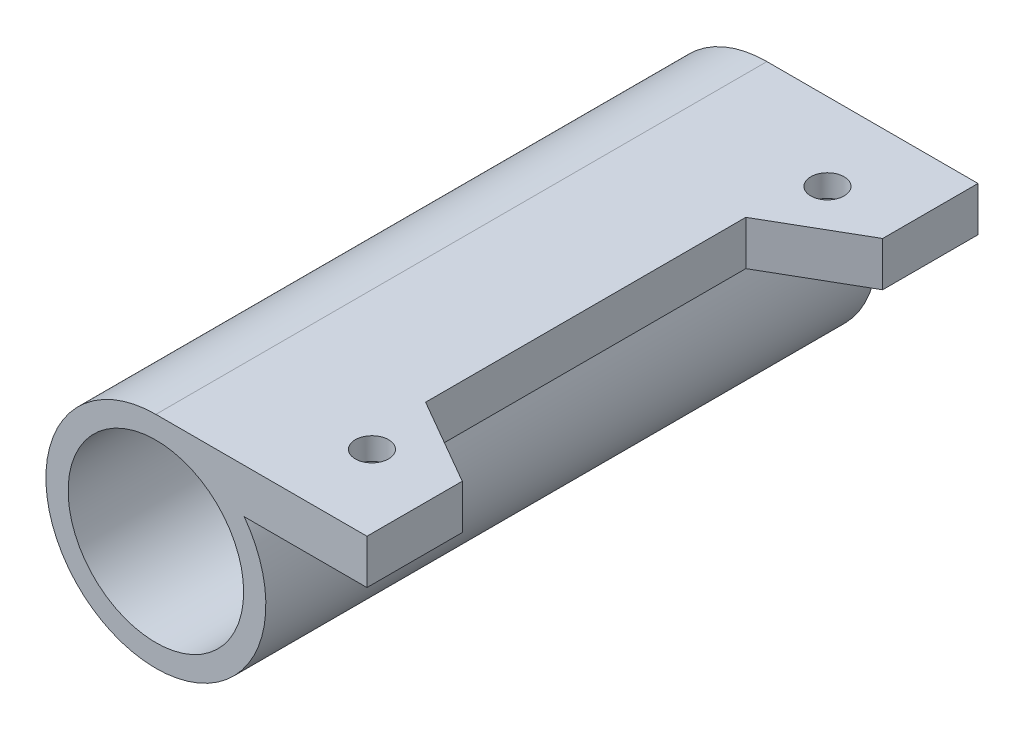
ISO-10303-21;
HEADER;
FILE_DESCRIPTION(('STEP AP214'),'2;1');
FILE_NAME('part.step','',(''),(''),'','','');
FILE_SCHEMA(('AUTOMOTIVE_DESIGN { 1 0 10303 214 1 1 1 1 }'));
ENDSEC;
DATA;
#1=APPLICATION_CONTEXT('core data for automotive mechanical design processes');
#2=APPLICATION_PROTOCOL_DEFINITION('international standard','automotive_design',2000,#1);
#3=PRODUCT_CONTEXT('',#1,'mechanical');
#4=PRODUCT('Part','Part','',(#3));
#5=PRODUCT_RELATED_PRODUCT_CATEGORY('part','',(#4));
#6=PRODUCT_DEFINITION_FORMATION('','',#4);
#7=PRODUCT_DEFINITION_CONTEXT('part definition',#1,'design');
#8=PRODUCT_DEFINITION('design','',#6,#7);
#9=PRODUCT_DEFINITION_SHAPE('','',#8);
#10=(LENGTH_UNIT() NAMED_UNIT(*) SI_UNIT(.MILLI.,.METRE.));
#11=(NAMED_UNIT(*) PLANE_ANGLE_UNIT() SI_UNIT($,.RADIAN.));
#12=(NAMED_UNIT(*) SI_UNIT($,.STERADIAN.) SOLID_ANGLE_UNIT());
#13=UNCERTAINTY_MEASURE_WITH_UNIT(LENGTH_MEASURE(1.E-05),#10,'distance_accuracy_value','');
#14=(GEOMETRIC_REPRESENTATION_CONTEXT(3) GLOBAL_UNCERTAINTY_ASSIGNED_CONTEXT((#13)) GLOBAL_UNIT_ASSIGNED_CONTEXT((#10,
#11,#12)) REPRESENTATION_CONTEXT('',''));
#15=CARTESIAN_POINT('',(0.,0.,0.));
#16=DIRECTION('',(0.,0.,1.));
#17=DIRECTION('',(1.,0.,0.));
#18=AXIS2_PLACEMENT_3D('',#15,#16,#17);
#19=CARTESIAN_POINT('',(19.,0.,48.));
#20=DIRECTION('',(1.,0.,0.));
#21=DIRECTION('',(0.,1.,0.));
#22=AXIS2_PLACEMENT_3D('',#19,#20,#21);
#23=PLANE('',#22);
#24=DIRECTION('',(0.,1.,0.));
#25=VECTOR('',#24,1.);
#26=CARTESIAN_POINT('',(19.,-0.0999999999999994,39.4211480564501));
#27=LINE('',#26,#25);
#28=CARTESIAN_POINT('',(19.,5.9,39.4211480564501));
#29=VERTEX_POINT('',#28);
#30=CARTESIAN_POINT('',(19.,9.9,39.4211480564501));
#31=VERTEX_POINT('',#30);
#32=EDGE_CURVE('E198',#29,#31,#27,.T.);
#33=ORIENTED_EDGE('',*,*,#32,.T.);
#34=DIRECTION('',(0.,0.,-1.));
#35=VECTOR('',#34,1.);
#36=CARTESIAN_POINT('',(19.,9.9,48.));
#37=LINE('',#36,#35);
#38=CARTESIAN_POINT('',(19.,9.9,48.));
#39=VERTEX_POINT('',#38);
#40=EDGE_CURVE('E341',#39,#31,#37,.T.);
#41=ORIENTED_EDGE('',*,*,#40,.F.);
#42=DIRECTION('',(0.,-1.,0.));
#43=VECTOR('',#42,1.);
#44=CARTESIAN_POINT('',(19.,0.,48.));
#45=LINE('',#44,#43);
#46=CARTESIAN_POINT('',(19.,5.9,48.));
#47=VERTEX_POINT('',#46);
#48=EDGE_CURVE('E332',#39,#47,#45,.T.);
#49=ORIENTED_EDGE('',*,*,#48,.T.);
#50=DIRECTION('',(0.,0.,-1.));
#51=VECTOR('',#50,1.);
#52=CARTESIAN_POINT('',(19.,5.9,48.));
#53=LINE('',#52,#51);
#54=EDGE_CURVE('E45',#47,#29,#53,.T.);
#55=ORIENTED_EDGE('',*,*,#54,.T.);
#56=EDGE_LOOP('',(#33,#41,#49,#55));
#57=FACE_BOUND('',#56,.T.);
#58=ADVANCED_FACE('F36',(#57),#23,.T.);
#59=CARTESIAN_POINT('',(0.,0.,48.));
#60=DIRECTION('',(0.,0.,-1.));
#61=DIRECTION('',(-1.,0.,0.));
#62=AXIS2_PLACEMENT_3D('',#59,#60,#61);
#63=CYLINDRICAL_SURFACE('',#62,9.9);
#64=DIRECTION('',(0.,0.,-1.));
#65=VECTOR('',#64,1.);
#66=CARTESIAN_POINT('',(0.,9.9,48.));
#67=LINE('',#66,#65);
#68=CARTESIAN_POINT('',(0.,9.9,48.));
#69=VERTEX_POINT('',#68);
#70=CARTESIAN_POINT('',(0.,9.9,-7.));
#71=VERTEX_POINT('',#70);
#72=EDGE_CURVE('E338',#69,#71,#67,.T.);
#73=ORIENTED_EDGE('',*,*,#72,.T.);
#74=CARTESIAN_POINT('',(0.,0.,-7.));
#75=DIRECTION('',(0.,0.,1.));
#76=DIRECTION('',(1.,0.,0.));
#77=AXIS2_PLACEMENT_3D('',#74,#75,#76);
#78=CIRCLE('',#77,9.9);
#79=CARTESIAN_POINT('',(7.94984276574072,5.9,-7.));
#80=VERTEX_POINT('',#79);
#81=EDGE_CURVE('E312',#71,#80,#78,.T.);
#82=ORIENTED_EDGE('',*,*,#81,.T.);
#83=DIRECTION('',(0.,0.,-1.));
#84=VECTOR('',#83,1.);
#85=CARTESIAN_POINT('',(7.94984276574072,5.9,48.));
#86=LINE('',#85,#84);
#87=CARTESIAN_POINT('',(7.94984276574072,5.9,48.));
#88=VERTEX_POINT('',#87);
#89=EDGE_CURVE('E11',#88,#80,#86,.T.);
#90=ORIENTED_EDGE('',*,*,#89,.F.);
#91=CARTESIAN_POINT('',(0.,0.,48.));
#92=DIRECTION('',(0.,0.,1.));
#93=DIRECTION('',(1.,0.,0.));
#94=AXIS2_PLACEMENT_3D('',#91,#92,#93);
#95=CIRCLE('',#94,9.9);
#96=EDGE_CURVE('E327',#69,#88,#95,.T.);
#97=ORIENTED_EDGE('',*,*,#96,.F.);
#98=EDGE_LOOP('',(#73,#82,#90,#97));
#99=FACE_BOUND('',#98,.T.);
#100=ADVANCED_FACE('F384',(#99),#63,.T.);
#101=CARTESIAN_POINT('',(0.,5.9,48.));
#102=DIRECTION('',(0.,-1.,0.));
#103=DIRECTION('',(1.,0.,0.));
#104=AXIS2_PLACEMENT_3D('',#101,#102,#103);
#105=PLANE('',#104);
#106=DIRECTION('',(-0.866025403784436,0.,-0.500000000000004));
#107=VECTOR('',#106,1.);
#108=CARTESIAN_POINT('',(8.46475185920994,5.9,33.3386197063854));
#109=LINE('',#108,#107);
#110=CARTESIAN_POINT('',(11.1908206940399,5.9,34.9125162820039));
#111=VERTEX_POINT('',#110);
#112=EDGE_CURVE('E206',#29,#111,#109,.T.);
#113=ORIENTED_EDGE('',*,*,#112,.F.);
#114=ORIENTED_EDGE('',*,*,#54,.F.);
#115=DIRECTION('',(-1.,0.,0.));
#116=VECTOR('',#115,1.);
#117=CARTESIAN_POINT('',(0.,5.9,48.));
#118=LINE('',#117,#116);
#119=EDGE_CURVE('E329',#47,#88,#118,.T.);
#120=ORIENTED_EDGE('',*,*,#119,.T.);
#121=ORIENTED_EDGE('',*,*,#89,.T.);
#122=DIRECTION('',(-1.,0.,0.));
#123=VECTOR('',#122,1.);
#124=CARTESIAN_POINT('',(0.,5.9,-7.));
#125=LINE('',#124,#123);
#126=CARTESIAN_POINT('',(19.,5.9,-7.));
#127=VERTEX_POINT('',#126);
#128=EDGE_CURVE('E315',#127,#80,#125,.T.);
#129=ORIENTED_EDGE('',*,*,#128,.F.);
#130=CARTESIAN_POINT('',(19.,5.9,1.57885194354986));
#131=VERTEX_POINT('',#130);
#132=EDGE_CURVE('E343',#131,#127,#53,.T.);
#133=ORIENTED_EDGE('',*,*,#132,.F.);
#134=DIRECTION('',(0.866025403784436,0.,-0.500000000000004));
#135=VECTOR('',#134,1.);
#136=CARTESIAN_POINT('',(-15.3509467448622,5.9,21.4113802936148));
#137=LINE('',#136,#135);
#138=CARTESIAN_POINT('',(11.1908206940399,5.9,6.08748371799604));
#139=VERTEX_POINT('',#138);
#140=EDGE_CURVE('E201',#139,#131,#137,.T.);
#141=ORIENTED_EDGE('',*,*,#140,.F.);
#142=DIRECTION('',(0.,0.,-1.));
#143=VECTOR('',#142,1.);
#144=CARTESIAN_POINT('',(11.1908206940399,5.9,48.));
#145=LINE('',#144,#143);
#146=EDGE_CURVE('E182',#111,#139,#145,.T.);
#147=ORIENTED_EDGE('',*,*,#146,.F.);
#148=EDGE_LOOP('',(#113,#114,#120,#121,#129,#133,#141,#147));
#149=FACE_BOUND('',#148,.T.);
#150=DIRECTION('',(-0.866025403784438,0.,-0.500000000000001));
#151=VECTOR('',#150,1.);
#152=CARTESIAN_POINT('',(9.44984276574072,5.9,42.7320508075689));
#153=LINE('',#152,#151);
#154=CARTESIAN_POINT('',(12.4498427657407,5.9,44.4641016151378));
#155=VERTEX_POINT('',#154);
#156=CARTESIAN_POINT('',(9.44984276574072,5.9,42.7320508075689));
#157=VERTEX_POINT('',#156);
#158=EDGE_CURVE('E61',#155,#157,#153,.T.);
#159=ORIENTED_EDGE('',*,*,#158,.F.);
#160=DIRECTION('',(-0.866025403784438,0.,0.500000000000001));
#161=VECTOR('',#160,1.);
#162=CARTESIAN_POINT('',(12.4498427657407,5.9,44.4641016151378));
#163=LINE('',#162,#161);
#164=CARTESIAN_POINT('',(15.4498427657407,5.9,42.7320508075689));
#165=VERTEX_POINT('',#164);
#166=EDGE_CURVE('E219',#165,#155,#163,.T.);
#167=ORIENTED_EDGE('',*,*,#166,.F.);
#168=DIRECTION('',(0.,0.,1.));
#169=VECTOR('',#168,1.);
#170=CARTESIAN_POINT('',(15.4498427657407,5.9,42.7320508075689));
#171=LINE('',#170,#169);
#172=CARTESIAN_POINT('',(15.4498427657407,5.9,39.2679491924311));
#173=VERTEX_POINT('',#172);
#174=EDGE_CURVE('E245',#173,#165,#171,.T.);
#175=ORIENTED_EDGE('',*,*,#174,.F.);
#176=DIRECTION('',(0.866025403784438,0.,0.5));
#177=VECTOR('',#176,1.);
#178=CARTESIAN_POINT('',(15.4498427657407,5.9,39.2679491924311));
#179=LINE('',#178,#177);
#180=CARTESIAN_POINT('',(12.4498427657407,5.9,37.5358983848622));
#181=VERTEX_POINT('',#180);
#182=EDGE_CURVE('E242',#181,#173,#179,.T.);
#183=ORIENTED_EDGE('',*,*,#182,.F.);
#184=DIRECTION('',(0.866025403784439,0.,-0.5));
#185=VECTOR('',#184,1.);
#186=CARTESIAN_POINT('',(12.4498427657407,5.9,37.5358983848622));
#187=LINE('',#186,#185);
#188=CARTESIAN_POINT('',(9.44984276574072,5.9,39.2679491924311));
#189=VERTEX_POINT('',#188);
#190=EDGE_CURVE('E239',#189,#181,#187,.T.);
#191=ORIENTED_EDGE('',*,*,#190,.F.);
#192=DIRECTION('',(0.,0.,-1.));
#193=VECTOR('',#192,1.);
#194=CARTESIAN_POINT('',(9.44984276574072,5.9,39.2679491924311));
#195=LINE('',#194,#193);
#196=EDGE_CURVE('E236',#157,#189,#195,.T.);
#197=ORIENTED_EDGE('',*,*,#196,.F.);
#198=EDGE_LOOP('',(#159,#167,#175,#183,#191,#197));
#199=FACE_BOUND('',#198,.T.);
#200=DIRECTION('',(0.866025403784438,0.,0.5));
#201=VECTOR('',#200,1.);
#202=CARTESIAN_POINT('',(12.4498427657407,5.9,-3.46410161513776));
#203=LINE('',#202,#201);
#204=CARTESIAN_POINT('',(12.4498427657407,5.9,-3.46410161513776));
#205=VERTEX_POINT('',#204);
#206=CARTESIAN_POINT('',(15.4498427657407,5.9,-1.73205080756888));
#207=VERTEX_POINT('',#206);
#208=EDGE_CURVE('E252',#205,#207,#203,.T.);
#209=ORIENTED_EDGE('',*,*,#208,.F.);
#210=DIRECTION('',(0.866025403784438,0.,-0.5));
#211=VECTOR('',#210,1.);
#212=CARTESIAN_POINT('',(9.44984276574072,5.9,-1.73205080756888));
#213=LINE('',#212,#211);
#214=CARTESIAN_POINT('',(9.44984276574072,5.9,-1.73205080756888));
#215=VERTEX_POINT('',#214);
#216=EDGE_CURVE('E266',#215,#205,#213,.T.);
#217=ORIENTED_EDGE('',*,*,#216,.F.);
#218=DIRECTION('',(0.,0.,-1.));
#219=VECTOR('',#218,1.);
#220=CARTESIAN_POINT('',(9.44984276574072,5.9,1.73205080756888));
#221=LINE('',#220,#219);
#222=CARTESIAN_POINT('',(9.44984276574072,5.9,1.73205080756888));
#223=VERTEX_POINT('',#222);
#224=EDGE_CURVE('E292',#223,#215,#221,.T.);
#225=ORIENTED_EDGE('',*,*,#224,.F.);
#226=DIRECTION('',(-0.866025403784439,0.,-0.5));
#227=VECTOR('',#226,1.);
#228=CARTESIAN_POINT('',(12.4498427657407,5.9,3.46410161513776));
#229=LINE('',#228,#227);
#230=CARTESIAN_POINT('',(12.4498427657407,5.9,3.46410161513776));
#231=VERTEX_POINT('',#230);
#232=EDGE_CURVE('E289',#231,#223,#229,.T.);
#233=ORIENTED_EDGE('',*,*,#232,.F.);
#234=DIRECTION('',(-0.866025403784439,0.,0.5));
#235=VECTOR('',#234,1.);
#236=CARTESIAN_POINT('',(15.4498427657407,5.9,1.73205080756888));
#237=LINE('',#236,#235);
#238=CARTESIAN_POINT('',(15.4498427657407,5.9,1.73205080756888));
#239=VERTEX_POINT('',#238);
#240=EDGE_CURVE('E286',#239,#231,#237,.T.);
#241=ORIENTED_EDGE('',*,*,#240,.F.);
#242=DIRECTION('',(0.,0.,1.));
#243=VECTOR('',#242,1.);
#244=CARTESIAN_POINT('',(15.4498427657407,5.9,-1.73205080756888));
#245=LINE('',#244,#243);
#246=EDGE_CURVE('E283',#207,#239,#245,.T.);
#247=ORIENTED_EDGE('',*,*,#246,.F.);
#248=EDGE_LOOP('',(#209,#217,#225,#233,#241,#247));
#249=FACE_BOUND('',#248,.T.);
#250=ADVANCED_FACE('F381',(#149,#199,#249),#105,.T.);
#251=DIRECTION('',(0.,1.,0.));
#252=VECTOR('',#251,1.);
#253=CARTESIAN_POINT('',(19.,-0.0999999999999994,1.57885194354986));
#254=LINE('',#253,#252);
#255=CARTESIAN_POINT('',(19.,9.9,1.57885194354987));
#256=VERTEX_POINT('',#255);
#257=EDGE_CURVE('E53',#131,#256,#254,.T.);
#258=ORIENTED_EDGE('',*,*,#257,.F.);
#259=ORIENTED_EDGE('',*,*,#132,.T.);
#260=DIRECTION('',(0.,-1.,0.));
#261=VECTOR('',#260,1.);
#262=CARTESIAN_POINT('',(19.,0.,-7.));
#263=LINE('',#262,#261);
#264=CARTESIAN_POINT('',(19.,9.9,-7.));
#265=VERTEX_POINT('',#264);
#266=EDGE_CURVE('E318',#265,#127,#263,.T.);
#267=ORIENTED_EDGE('',*,*,#266,.F.);
#268=EDGE_CURVE('E340',#256,#265,#37,.T.);
#269=ORIENTED_EDGE('',*,*,#268,.F.);
#270=EDGE_LOOP('',(#258,#259,#267,#269));
#271=FACE_BOUND('',#270,.T.);
#272=ADVANCED_FACE('F383',(#271),#23,.T.);
#273=CARTESIAN_POINT('',(0.,0.,48.));
#274=DIRECTION('',(0.,0.,-1.));
#275=DIRECTION('',(-1.,0.,0.));
#276=AXIS2_PLACEMENT_3D('',#273,#274,#275);
#277=CYLINDRICAL_SURFACE('',#276,7.9);
#278=CARTESIAN_POINT('',(0.,0.,48.));
#279=DIRECTION('',(0.,0.,1.));
#280=DIRECTION('',(1.,0.,0.));
#281=AXIS2_PLACEMENT_3D('',#278,#279,#280);
#282=CIRCLE('',#281,7.9);
#283=CARTESIAN_POINT('',(7.9,0.,48.));
#284=VERTEX_POINT('',#283);
#285=EDGE_CURVE('E324',#284,#284,#282,.T.);
#286=ORIENTED_EDGE('',*,*,#285,.T.);
#287=EDGE_LOOP('',(#286));
#288=FACE_BOUND('',#287,.T.);
#289=CARTESIAN_POINT('',(0.,0.,-7.));
#290=DIRECTION('',(0.,0.,1.));
#291=DIRECTION('',(1.,0.,0.));
#292=AXIS2_PLACEMENT_3D('',#289,#290,#291);
#293=CIRCLE('',#292,7.9);
#294=CARTESIAN_POINT('',(7.9,0.,-7.));
#295=VERTEX_POINT('',#294);
#296=EDGE_CURVE('E299',#295,#295,#293,.T.);
#297=ORIENTED_EDGE('',*,*,#296,.F.);
#298=EDGE_LOOP('',(#297));
#299=FACE_BOUND('',#298,.T.);
#300=ADVANCED_FACE('F38',(#288,#299),#277,.F.);
#301=CARTESIAN_POINT('',(0.,9.9,48.));
#302=DIRECTION('',(0.,1.,0.));
#303=DIRECTION('',(0.,0.,1.));
#304=AXIS2_PLACEMENT_3D('',#301,#302,#303);
#305=PLANE('',#304);
#306=DIRECTION('',(0.866025403784436,0.,0.500000000000004));
#307=VECTOR('',#306,1.);
#308=CARTESIAN_POINT('',(11.1908206940399,9.9,34.9125162820039));
#309=LINE('',#308,#307);
#310=CARTESIAN_POINT('',(11.1908206940399,9.9,34.9125162820039));
#311=VERTEX_POINT('',#310);
#312=EDGE_CURVE('E194',#311,#31,#309,.T.);
#313=ORIENTED_EDGE('',*,*,#312,.F.);
#314=DIRECTION('',(0.,0.,1.));
#315=VECTOR('',#314,1.);
#316=CARTESIAN_POINT('',(11.1908206940399,9.9,6.08748371799604));
#317=LINE('',#316,#315);
#318=CARTESIAN_POINT('',(11.1908206940399,9.9,6.08748371799604));
#319=VERTEX_POINT('',#318);
#320=EDGE_CURVE('E179',#319,#311,#317,.T.);
#321=ORIENTED_EDGE('',*,*,#320,.F.);
#322=DIRECTION('',(-0.866025403784436,0.,0.500000000000004));
#323=VECTOR('',#322,1.);
#324=CARTESIAN_POINT('',(19.,9.9,1.57885194354986));
#325=LINE('',#324,#323);
#326=EDGE_CURVE('E186',#256,#319,#325,.T.);
#327=ORIENTED_EDGE('',*,*,#326,.F.);
#328=ORIENTED_EDGE('',*,*,#268,.T.);
#329=DIRECTION('',(1.,0.,0.));
#330=VECTOR('',#329,1.);
#331=CARTESIAN_POINT('',(0.,9.9,-7.));
#332=LINE('',#331,#330);
#333=EDGE_CURVE('E321',#71,#265,#332,.T.);
#334=ORIENTED_EDGE('',*,*,#333,.F.);
#335=ORIENTED_EDGE('',*,*,#72,.F.);
#336=DIRECTION('',(1.,0.,0.));
#337=VECTOR('',#336,1.);
#338=CARTESIAN_POINT('',(0.,9.9,48.));
#339=LINE('',#338,#337);
#340=EDGE_CURVE('E335',#69,#39,#339,.T.);
#341=ORIENTED_EDGE('',*,*,#340,.T.);
#342=ORIENTED_EDGE('',*,*,#40,.T.);
#343=EDGE_LOOP('',(#313,#321,#327,#328,#334,#335,#341,#342));
#344=FACE_BOUND('',#343,.T.);
#345=CARTESIAN_POINT('',(12.4498427657407,9.9,41.));
#346=DIRECTION('',(0.,1.,0.));
#347=DIRECTION('',(0.,0.,-1.));
#348=AXIS2_PLACEMENT_3D('',#345,#346,#347);
#349=CIRCLE('',#348,1.5);
#350=CARTESIAN_POINT('',(12.4498427657407,9.9,39.5));
#351=VERTEX_POINT('',#350);
#352=EDGE_CURVE('E208',#351,#351,#349,.T.);
#353=ORIENTED_EDGE('',*,*,#352,.F.);
#354=EDGE_LOOP('',(#353));
#355=FACE_BOUND('',#354,.T.);
#356=CARTESIAN_POINT('',(12.4498427657407,9.9,0.));
#357=DIRECTION('',(0.,1.,0.));
#358=DIRECTION('',(0.,0.,1.));
#359=AXIS2_PLACEMENT_3D('',#356,#357,#358);
#360=CIRCLE('',#359,1.5);
#361=CARTESIAN_POINT('',(12.4498427657407,9.9,1.5));
#362=VERTEX_POINT('',#361);
#363=EDGE_CURVE('E211',#362,#362,#360,.T.);
#364=ORIENTED_EDGE('',*,*,#363,.F.);
#365=EDGE_LOOP('',(#364));
#366=FACE_BOUND('',#365,.T.);
#367=ADVANCED_FACE('F191',(#344,#355,#366),#305,.T.);
#368=CARTESIAN_POINT('',(0.,0.,48.));
#369=DIRECTION('',(0.,0.,1.));
#370=DIRECTION('',(1.,0.,0.));
#371=AXIS2_PLACEMENT_3D('',#368,#369,#370);
#372=PLANE('',#371);
#373=ORIENTED_EDGE('',*,*,#285,.F.);
#374=EDGE_LOOP('',(#373));
#375=FACE_BOUND('',#374,.T.);
#376=ORIENTED_EDGE('',*,*,#96,.T.);
#377=ORIENTED_EDGE('',*,*,#119,.F.);
#378=ORIENTED_EDGE('',*,*,#48,.F.);
#379=ORIENTED_EDGE('',*,*,#340,.F.);
#380=EDGE_LOOP('',(#376,#377,#378,#379));
#381=FACE_BOUND('',#380,.T.);
#382=ADVANCED_FACE('F403',(#375,#381),#372,.T.);
#383=CARTESIAN_POINT('',(0.,0.,-7.));
#384=DIRECTION('',(0.,0.,1.));
#385=DIRECTION('',(1.,0.,0.));
#386=AXIS2_PLACEMENT_3D('',#383,#384,#385);
#387=PLANE('',#386);
#388=ORIENTED_EDGE('',*,*,#296,.T.);
#389=EDGE_LOOP('',(#388));
#390=FACE_BOUND('',#389,.T.);
#391=ORIENTED_EDGE('',*,*,#81,.F.);
#392=ORIENTED_EDGE('',*,*,#333,.T.);
#393=ORIENTED_EDGE('',*,*,#266,.T.);
#394=ORIENTED_EDGE('',*,*,#128,.T.);
#395=EDGE_LOOP('',(#391,#392,#393,#394));
#396=FACE_BOUND('',#395,.T.);
#397=ADVANCED_FACE('F406',(#390,#396),#387,.F.);
#398=CARTESIAN_POINT('',(12.4498427657407,7.9,-3.46410161513776));
#399=DIRECTION('',(0.5,0.,-0.866025403784438));
#400=DIRECTION('',(-0.866025403784439,0.,-0.5));
#401=AXIS2_PLACEMENT_3D('',#398,#399,#400);
#402=PLANE('',#401);
#403=ORIENTED_EDGE('',*,*,#208,.T.);
#404=DIRECTION('',(0.,-1.,0.));
#405=VECTOR('',#404,1.);
#406=CARTESIAN_POINT('',(15.4498427657407,7.9,-1.73205080756888));
#407=LINE('',#406,#405);
#408=CARTESIAN_POINT('',(15.4498427657407,7.9,-1.73205080756888));
#409=VERTEX_POINT('',#408);
#410=EDGE_CURVE('E281',#409,#207,#407,.T.);
#411=ORIENTED_EDGE('',*,*,#410,.F.);
#412=DIRECTION('',(0.866025403784438,0.,0.5));
#413=VECTOR('',#412,1.);
#414=CARTESIAN_POINT('',(12.4498427657407,7.9,-3.46410161513776));
#415=LINE('',#414,#413);
#416=CARTESIAN_POINT('',(12.4498427657407,7.9,-3.46410161513776));
#417=VERTEX_POINT('',#416);
#418=EDGE_CURVE('E262',#417,#409,#415,.T.);
#419=ORIENTED_EDGE('',*,*,#418,.F.);
#420=DIRECTION('',(0.,-1.,0.));
#421=VECTOR('',#420,1.);
#422=CARTESIAN_POINT('',(12.4498427657407,7.9,-3.46410161513776));
#423=LINE('',#422,#421);
#424=EDGE_CURVE('E297',#417,#205,#423,.T.);
#425=ORIENTED_EDGE('',*,*,#424,.T.);
#426=EDGE_LOOP('',(#403,#411,#419,#425));
#427=FACE_BOUND('',#426,.T.);
#428=ADVANCED_FACE('F361',(#427),#402,.F.);
#429=CARTESIAN_POINT('',(9.44984276574072,7.9,-1.73205080756888));
#430=DIRECTION('',(-0.5,0.,-0.866025403784438));
#431=DIRECTION('',(-0.866025403784439,0.,0.5));
#432=AXIS2_PLACEMENT_3D('',#429,#430,#431);
#433=PLANE('',#432);
#434=ORIENTED_EDGE('',*,*,#216,.T.);
#435=ORIENTED_EDGE('',*,*,#424,.F.);
#436=DIRECTION('',(0.866025403784438,0.,-0.5));
#437=VECTOR('',#436,1.);
#438=CARTESIAN_POINT('',(9.44984276574072,7.9,-1.73205080756888));
#439=LINE('',#438,#437);
#440=CARTESIAN_POINT('',(9.44984276574072,7.9,-1.73205080756888));
#441=VERTEX_POINT('',#440);
#442=EDGE_CURVE('E278',#441,#417,#439,.T.);
#443=ORIENTED_EDGE('',*,*,#442,.F.);
#444=DIRECTION('',(0.,-1.,0.));
#445=VECTOR('',#444,1.);
#446=CARTESIAN_POINT('',(9.44984276574072,7.9,-1.73205080756888));
#447=LINE('',#446,#445);
#448=EDGE_CURVE('E300',#441,#215,#447,.T.);
#449=ORIENTED_EDGE('',*,*,#448,.T.);
#450=EDGE_LOOP('',(#434,#435,#443,#449));
#451=FACE_BOUND('',#450,.T.);
#452=ADVANCED_FACE('F379',(#451),#433,.F.);
#453=CARTESIAN_POINT('',(9.44984276574072,7.9,1.73205080756888));
#454=DIRECTION('',(-1.,0.,0.));
#455=DIRECTION('',(0.,-1.,0.));
#456=AXIS2_PLACEMENT_3D('',#453,#454,#455);
#457=PLANE('',#456);
#458=ORIENTED_EDGE('',*,*,#224,.T.);
#459=ORIENTED_EDGE('',*,*,#448,.F.);
#460=DIRECTION('',(0.,0.,-1.));
#461=VECTOR('',#460,1.);
#462=CARTESIAN_POINT('',(9.44984276574072,7.9,1.73205080756888));
#463=LINE('',#462,#461);
#464=CARTESIAN_POINT('',(9.44984276574072,7.9,1.73205080756888));
#465=VERTEX_POINT('',#464);
#466=EDGE_CURVE('E275',#465,#441,#463,.T.);
#467=ORIENTED_EDGE('',*,*,#466,.F.);
#468=DIRECTION('',(0.,-1.,0.));
#469=VECTOR('',#468,1.);
#470=CARTESIAN_POINT('',(9.44984276574072,7.9,1.73205080756888));
#471=LINE('',#470,#469);
#472=EDGE_CURVE('E302',#465,#223,#471,.T.);
#473=ORIENTED_EDGE('',*,*,#472,.T.);
#474=EDGE_LOOP('',(#458,#459,#467,#473));
#475=FACE_BOUND('',#474,.T.);
#476=ADVANCED_FACE('F376',(#475),#457,.F.);
#477=CARTESIAN_POINT('',(12.4498427657407,7.9,3.46410161513776));
#478=DIRECTION('',(-0.5,0.,0.866025403784439));
#479=DIRECTION('',(0.866025403784439,0.,0.5));
#480=AXIS2_PLACEMENT_3D('',#477,#478,#479);
#481=PLANE('',#480);
#482=ORIENTED_EDGE('',*,*,#232,.T.);
#483=ORIENTED_EDGE('',*,*,#472,.F.);
#484=DIRECTION('',(-0.866025403784439,0.,-0.5));
#485=VECTOR('',#484,1.);
#486=CARTESIAN_POINT('',(12.4498427657407,7.9,3.46410161513776));
#487=LINE('',#486,#485);
#488=CARTESIAN_POINT('',(12.4498427657407,7.9,3.46410161513776));
#489=VERTEX_POINT('',#488);
#490=EDGE_CURVE('E272',#489,#465,#487,.T.);
#491=ORIENTED_EDGE('',*,*,#490,.F.);
#492=DIRECTION('',(0.,-1.,0.));
#493=VECTOR('',#492,1.);
#494=CARTESIAN_POINT('',(12.4498427657407,7.9,3.46410161513776));
#495=LINE('',#494,#493);
#496=EDGE_CURVE('E304',#489,#231,#495,.T.);
#497=ORIENTED_EDGE('',*,*,#496,.T.);
#498=EDGE_LOOP('',(#482,#483,#491,#497));
#499=FACE_BOUND('',#498,.T.);
#500=ADVANCED_FACE('F372',(#499),#481,.F.);
#501=CARTESIAN_POINT('',(15.4498427657407,7.9,1.73205080756888));
#502=DIRECTION('',(0.5,0.,0.866025403784439));
#503=DIRECTION('',(0.866025403784439,0.,-0.5));
#504=AXIS2_PLACEMENT_3D('',#501,#502,#503);
#505=PLANE('',#504);
#506=ORIENTED_EDGE('',*,*,#240,.T.);
#507=ORIENTED_EDGE('',*,*,#496,.F.);
#508=DIRECTION('',(-0.866025403784439,0.,0.5));
#509=VECTOR('',#508,1.);
#510=CARTESIAN_POINT('',(15.4498427657407,7.9,1.73205080756888));
#511=LINE('',#510,#509);
#512=CARTESIAN_POINT('',(15.4498427657407,7.9,1.73205080756888));
#513=VERTEX_POINT('',#512);
#514=EDGE_CURVE('E269',#513,#489,#511,.T.);
#515=ORIENTED_EDGE('',*,*,#514,.F.);
#516=DIRECTION('',(0.,-1.,0.));
#517=VECTOR('',#516,1.);
#518=CARTESIAN_POINT('',(15.4498427657407,7.9,1.73205080756888));
#519=LINE('',#518,#517);
#520=EDGE_CURVE('E306',#513,#239,#519,.T.);
#521=ORIENTED_EDGE('',*,*,#520,.T.);
#522=EDGE_LOOP('',(#506,#507,#515,#521));
#523=FACE_BOUND('',#522,.T.);
#524=ADVANCED_FACE('F368',(#523),#505,.F.);
#525=CARTESIAN_POINT('',(15.4498427657407,7.9,-1.73205080756888));
#526=DIRECTION('',(1.,0.,0.));
#527=DIRECTION('',(0.,1.,0.));
#528=AXIS2_PLACEMENT_3D('',#525,#526,#527);
#529=PLANE('',#528);
#530=ORIENTED_EDGE('',*,*,#246,.T.);
#531=ORIENTED_EDGE('',*,*,#520,.F.);
#532=DIRECTION('',(0.,0.,1.));
#533=VECTOR('',#532,1.);
#534=CARTESIAN_POINT('',(15.4498427657407,7.9,-1.73205080756888));
#535=LINE('',#534,#533);
#536=EDGE_CURVE('E265',#409,#513,#535,.T.);
#537=ORIENTED_EDGE('',*,*,#536,.F.);
#538=ORIENTED_EDGE('',*,*,#410,.T.);
#539=EDGE_LOOP('',(#530,#531,#537,#538));
#540=FACE_BOUND('',#539,.T.);
#541=ADVANCED_FACE('F355',(#540),#529,.F.);
#542=CARTESIAN_POINT('',(0.,7.9,0.));
#543=DIRECTION('',(0.,-1.,0.));
#544=DIRECTION('',(0.,0.,-1.));
#545=AXIS2_PLACEMENT_3D('',#542,#543,#544);
#546=PLANE('',#545);
#547=CARTESIAN_POINT('',(12.4498427657407,7.9,0.));
#548=DIRECTION('',(0.,-1.,0.));
#549=DIRECTION('',(0.,0.,-1.));
#550=AXIS2_PLACEMENT_3D('',#547,#548,#549);
#551=CIRCLE('',#550,1.5);
#552=CARTESIAN_POINT('',(12.4498427657407,7.9,-1.5));
#553=VERTEX_POINT('',#552);
#554=EDGE_CURVE('E214',#553,#553,#551,.T.);
#555=ORIENTED_EDGE('',*,*,#554,.F.);
#556=EDGE_LOOP('',(#555));
#557=FACE_BOUND('',#556,.T.);
#558=ORIENTED_EDGE('',*,*,#418,.T.);
#559=ORIENTED_EDGE('',*,*,#536,.T.);
#560=ORIENTED_EDGE('',*,*,#514,.T.);
#561=ORIENTED_EDGE('',*,*,#490,.T.);
#562=ORIENTED_EDGE('',*,*,#466,.T.);
#563=ORIENTED_EDGE('',*,*,#442,.T.);
#564=EDGE_LOOP('',(#558,#559,#560,#561,#562,#563));
#565=FACE_BOUND('',#564,.T.);
#566=ADVANCED_FACE('F351',(#557,#565),#546,.T.);
#567=CARTESIAN_POINT('',(9.44984276574072,7.9,42.7320508075689));
#568=DIRECTION('',(-0.500000000000001,0.,0.866025403784438));
#569=DIRECTION('',(0.866025403784438,0.,0.500000000000001));
#570=AXIS2_PLACEMENT_3D('',#567,#568,#569);
#571=PLANE('',#570);
#572=ORIENTED_EDGE('',*,*,#158,.T.);
#573=DIRECTION('',(0.,-1.,0.));
#574=VECTOR('',#573,1.);
#575=CARTESIAN_POINT('',(9.44984276574072,7.9,42.7320508075689));
#576=LINE('',#575,#574);
#577=CARTESIAN_POINT('',(9.44984276574072,7.9,42.7320508075689));
#578=VERTEX_POINT('',#577);
#579=EDGE_CURVE('E234',#578,#157,#576,.T.);
#580=ORIENTED_EDGE('',*,*,#579,.F.);
#581=DIRECTION('',(-0.866025403784438,0.,-0.500000000000001));
#582=VECTOR('',#581,1.);
#583=CARTESIAN_POINT('',(9.44984276574072,7.9,42.7320508075689));
#584=LINE('',#583,#582);
#585=CARTESIAN_POINT('',(12.4498427657407,7.9,44.4641016151378));
#586=VERTEX_POINT('',#585);
#587=EDGE_CURVE('E215',#586,#578,#584,.T.);
#588=ORIENTED_EDGE('',*,*,#587,.F.);
#589=DIRECTION('',(0.,-1.,0.));
#590=VECTOR('',#589,1.);
#591=CARTESIAN_POINT('',(12.4498427657407,7.9,44.4641016151378));
#592=LINE('',#591,#590);
#593=EDGE_CURVE('E250',#586,#155,#592,.T.);
#594=ORIENTED_EDGE('',*,*,#593,.T.);
#595=EDGE_LOOP('',(#572,#580,#588,#594));
#596=FACE_BOUND('',#595,.T.);
#597=ADVANCED_FACE('F354',(#596),#571,.F.);
#598=CARTESIAN_POINT('',(12.4498427657407,7.9,44.4641016151378));
#599=DIRECTION('',(0.500000000000001,0.,0.866025403784438));
#600=DIRECTION('',(0.866025403784438,0.,-0.500000000000001));
#601=AXIS2_PLACEMENT_3D('',#598,#599,#600);
#602=PLANE('',#601);
#603=ORIENTED_EDGE('',*,*,#166,.T.);
#604=ORIENTED_EDGE('',*,*,#593,.F.);
#605=DIRECTION('',(-0.866025403784438,0.,0.500000000000001));
#606=VECTOR('',#605,1.);
#607=CARTESIAN_POINT('',(12.4498427657407,7.9,44.4641016151378));
#608=LINE('',#607,#606);
#609=CARTESIAN_POINT('',(15.4498427657407,7.9,42.7320508075689));
#610=VERTEX_POINT('',#609);
#611=EDGE_CURVE('E231',#610,#586,#608,.T.);
#612=ORIENTED_EDGE('',*,*,#611,.F.);
#613=DIRECTION('',(0.,-1.,0.));
#614=VECTOR('',#613,1.);
#615=CARTESIAN_POINT('',(15.4498427657407,7.9,42.7320508075689));
#616=LINE('',#615,#614);
#617=EDGE_CURVE('E253',#610,#165,#616,.T.);
#618=ORIENTED_EDGE('',*,*,#617,.T.);
#619=EDGE_LOOP('',(#603,#604,#612,#618));
#620=FACE_BOUND('',#619,.T.);
#621=ADVANCED_FACE('F425',(#620),#602,.F.);
#622=CARTESIAN_POINT('',(15.4498427657407,7.9,42.7320508075689));
#623=DIRECTION('',(1.,0.,0.));
#624=DIRECTION('',(0.,1.,0.));
#625=AXIS2_PLACEMENT_3D('',#622,#623,#624);
#626=PLANE('',#625);
#627=ORIENTED_EDGE('',*,*,#174,.T.);
#628=ORIENTED_EDGE('',*,*,#617,.F.);
#629=DIRECTION('',(0.,0.,1.));
#630=VECTOR('',#629,1.);
#631=CARTESIAN_POINT('',(15.4498427657407,7.9,42.7320508075689));
#632=LINE('',#631,#630);
#633=CARTESIAN_POINT('',(15.4498427657407,7.9,39.2679491924311));
#634=VERTEX_POINT('',#633);
#635=EDGE_CURVE('E228',#634,#610,#632,.T.);
#636=ORIENTED_EDGE('',*,*,#635,.F.);
#637=DIRECTION('',(0.,-1.,0.));
#638=VECTOR('',#637,1.);
#639=CARTESIAN_POINT('',(15.4498427657407,7.9,39.2679491924311));
#640=LINE('',#639,#638);
#641=EDGE_CURVE('E255',#634,#173,#640,.T.);
#642=ORIENTED_EDGE('',*,*,#641,.T.);
#643=EDGE_LOOP('',(#627,#628,#636,#642));
#644=FACE_BOUND('',#643,.T.);
#645=ADVANCED_FACE('F438',(#644),#626,.F.);
#646=CARTESIAN_POINT('',(15.4498427657407,7.9,39.2679491924311));
#647=DIRECTION('',(0.5,0.,-0.866025403784438));
#648=DIRECTION('',(-0.866025403784438,0.,-0.5));
#649=AXIS2_PLACEMENT_3D('',#646,#647,#648);
#650=PLANE('',#649);
#651=ORIENTED_EDGE('',*,*,#182,.T.);
#652=ORIENTED_EDGE('',*,*,#641,.F.);
#653=DIRECTION('',(0.866025403784438,0.,0.5));
#654=VECTOR('',#653,1.);
#655=CARTESIAN_POINT('',(15.4498427657407,7.9,39.2679491924311));
#656=LINE('',#655,#654);
#657=CARTESIAN_POINT('',(12.4498427657407,7.9,37.5358983848622));
#658=VERTEX_POINT('',#657);
#659=EDGE_CURVE('E225',#658,#634,#656,.T.);
#660=ORIENTED_EDGE('',*,*,#659,.F.);
#661=DIRECTION('',(0.,-1.,0.));
#662=VECTOR('',#661,1.);
#663=CARTESIAN_POINT('',(12.4498427657407,7.9,37.5358983848622));
#664=LINE('',#663,#662);
#665=EDGE_CURVE('E257',#658,#181,#664,.T.);
#666=ORIENTED_EDGE('',*,*,#665,.T.);
#667=EDGE_LOOP('',(#651,#652,#660,#666));
#668=FACE_BOUND('',#667,.T.);
#669=ADVANCED_FACE('F434',(#668),#650,.F.);
#670=CARTESIAN_POINT('',(12.4498427657407,7.9,37.5358983848622));
#671=DIRECTION('',(-0.5,0.,-0.866025403784439));
#672=DIRECTION('',(-0.866025403784439,0.,0.5));
#673=AXIS2_PLACEMENT_3D('',#670,#671,#672);
#674=PLANE('',#673);
#675=ORIENTED_EDGE('',*,*,#190,.T.);
#676=ORIENTED_EDGE('',*,*,#665,.F.);
#677=DIRECTION('',(0.866025403784439,0.,-0.5));
#678=VECTOR('',#677,1.);
#679=CARTESIAN_POINT('',(12.4498427657407,7.9,37.5358983848622));
#680=LINE('',#679,#678);
#681=CARTESIAN_POINT('',(9.44984276574072,7.9,39.2679491924311));
#682=VERTEX_POINT('',#681);
#683=EDGE_CURVE('E222',#682,#658,#680,.T.);
#684=ORIENTED_EDGE('',*,*,#683,.F.);
#685=DIRECTION('',(0.,-1.,0.));
#686=VECTOR('',#685,1.);
#687=CARTESIAN_POINT('',(9.44984276574072,7.9,39.2679491924311));
#688=LINE('',#687,#686);
#689=EDGE_CURVE('E259',#682,#189,#688,.T.);
#690=ORIENTED_EDGE('',*,*,#689,.T.);
#691=EDGE_LOOP('',(#675,#676,#684,#690));
#692=FACE_BOUND('',#691,.T.);
#693=ADVANCED_FACE('F430',(#692),#674,.F.);
#694=CARTESIAN_POINT('',(9.44984276574072,7.9,39.2679491924311));
#695=DIRECTION('',(-1.,0.,0.));
#696=DIRECTION('',(0.,-1.,0.));
#697=AXIS2_PLACEMENT_3D('',#694,#695,#696);
#698=PLANE('',#697);
#699=ORIENTED_EDGE('',*,*,#196,.T.);
#700=ORIENTED_EDGE('',*,*,#689,.F.);
#701=DIRECTION('',(0.,0.,-1.));
#702=VECTOR('',#701,1.);
#703=CARTESIAN_POINT('',(9.44984276574072,7.9,39.2679491924311));
#704=LINE('',#703,#702);
#705=EDGE_CURVE('E218',#578,#682,#704,.T.);
#706=ORIENTED_EDGE('',*,*,#705,.F.);
#707=ORIENTED_EDGE('',*,*,#579,.T.);
#708=EDGE_LOOP('',(#699,#700,#706,#707));
#709=FACE_BOUND('',#708,.T.);
#710=ADVANCED_FACE('F426',(#709),#698,.F.);
#711=CARTESIAN_POINT('',(0.,7.89999999999999,0.));
#712=DIRECTION('',(0.,1.,0.));
#713=DIRECTION('',(0.,0.,1.));
#714=AXIS2_PLACEMENT_3D('',#711,#712,#713);
#715=PLANE('',#714);
#716=CARTESIAN_POINT('',(12.4498427657407,7.9,41.));
#717=DIRECTION('',(0.,1.,0.));
#718=DIRECTION('',(0.,0.,1.));
#719=AXIS2_PLACEMENT_3D('',#716,#717,#718);
#720=CIRCLE('',#719,1.5);
#721=CARTESIAN_POINT('',(12.4498427657407,7.9,42.5));
#722=VERTEX_POINT('',#721);
#723=EDGE_CURVE('E40',#722,#722,#720,.T.);
#724=ORIENTED_EDGE('',*,*,#723,.T.);
#725=EDGE_LOOP('',(#724));
#726=FACE_BOUND('',#725,.T.);
#727=ORIENTED_EDGE('',*,*,#587,.T.);
#728=ORIENTED_EDGE('',*,*,#705,.T.);
#729=ORIENTED_EDGE('',*,*,#683,.T.);
#730=ORIENTED_EDGE('',*,*,#659,.T.);
#731=ORIENTED_EDGE('',*,*,#635,.T.);
#732=ORIENTED_EDGE('',*,*,#611,.T.);
#733=EDGE_LOOP('',(#727,#728,#729,#730,#731,#732));
#734=FACE_BOUND('',#733,.T.);
#735=ADVANCED_FACE('F429',(#726,#734),#715,.F.);
#736=CARTESIAN_POINT('',(12.4498427657407,-0.100000000000001,0.));
#737=DIRECTION('',(0.,1.,0.));
#738=DIRECTION('',(0.,0.,1.));
#739=AXIS2_PLACEMENT_3D('',#736,#737,#738);
#740=CYLINDRICAL_SURFACE('',#739,1.5);
#741=ORIENTED_EDGE('',*,*,#554,.T.);
#742=EDGE_LOOP('',(#741));
#743=FACE_BOUND('',#742,.T.);
#744=ORIENTED_EDGE('',*,*,#363,.T.);
#745=EDGE_LOOP('',(#744));
#746=FACE_BOUND('',#745,.T.);
#747=ADVANCED_FACE('F348',(#743,#746),#740,.F.);
#748=CARTESIAN_POINT('',(12.4498427657407,-0.100000000000001,41.));
#749=DIRECTION('',(0.,1.,0.));
#750=DIRECTION('',(0.,0.,1.));
#751=AXIS2_PLACEMENT_3D('',#748,#749,#750);
#752=CYLINDRICAL_SURFACE('',#751,1.5);
#753=ORIENTED_EDGE('',*,*,#352,.T.);
#754=EDGE_LOOP('',(#753));
#755=FACE_BOUND('',#754,.T.);
#756=ORIENTED_EDGE('',*,*,#723,.F.);
#757=EDGE_LOOP('',(#756));
#758=FACE_BOUND('',#757,.T.);
#759=ADVANCED_FACE('F451',(#755,#758),#752,.F.);
#760=CARTESIAN_POINT('',(11.1908206940399,-0.0999999999999994,34.9125162820039));
#761=DIRECTION('',(-0.500000000000004,0.,0.866025403784436));
#762=DIRECTION('',(0.866025403784436,0.,0.500000000000004));
#763=AXIS2_PLACEMENT_3D('',#760,#761,#762);
#764=PLANE('',#763);
#765=ORIENTED_EDGE('',*,*,#112,.T.);
#766=DIRECTION('',(0.,1.,0.));
#767=VECTOR('',#766,1.);
#768=CARTESIAN_POINT('',(11.1908206940399,-0.0999999999999994,34.9125162820039));
#769=LINE('',#768,#767);
#770=EDGE_CURVE('E184',#111,#311,#769,.T.);
#771=ORIENTED_EDGE('',*,*,#770,.T.);
#772=ORIENTED_EDGE('',*,*,#312,.T.);
#773=ORIENTED_EDGE('',*,*,#32,.F.);
#774=EDGE_LOOP('',(#765,#771,#772,#773));
#775=FACE_BOUND('',#774,.T.);
#776=ADVANCED_FACE('F454',(#775),#764,.F.);
#777=CARTESIAN_POINT('',(11.1908206940399,-0.0999999999999994,6.08748371799604));
#778=DIRECTION('',(-1.,0.,0.));
#779=DIRECTION('',(0.,0.,1.));
#780=AXIS2_PLACEMENT_3D('',#777,#778,#779);
#781=PLANE('',#780);
#782=ORIENTED_EDGE('',*,*,#146,.T.);
#783=DIRECTION('',(0.,1.,0.));
#784=VECTOR('',#783,1.);
#785=CARTESIAN_POINT('',(11.1908206940399,-0.0999999999999994,6.08748371799604));
#786=LINE('',#785,#784);
#787=EDGE_CURVE('E175',#139,#319,#786,.T.);
#788=ORIENTED_EDGE('',*,*,#787,.T.);
#789=ORIENTED_EDGE('',*,*,#320,.T.);
#790=ORIENTED_EDGE('',*,*,#770,.F.);
#791=EDGE_LOOP('',(#782,#788,#789,#790));
#792=FACE_BOUND('',#791,.T.);
#793=ADVANCED_FACE('F176',(#792),#781,.F.);
#794=CARTESIAN_POINT('',(19.,-0.0999999999999994,1.57885194354986));
#795=DIRECTION('',(-0.500000000000004,0.,-0.866025403784436));
#796=DIRECTION('',(-0.866025403784436,0.,0.500000000000004));
#797=AXIS2_PLACEMENT_3D('',#794,#795,#796);
#798=PLANE('',#797);
#799=ORIENTED_EDGE('',*,*,#140,.T.);
#800=ORIENTED_EDGE('',*,*,#257,.T.);
#801=ORIENTED_EDGE('',*,*,#326,.T.);
#802=ORIENTED_EDGE('',*,*,#787,.F.);
#803=EDGE_LOOP('',(#799,#800,#801,#802));
#804=FACE_BOUND('',#803,.T.);
#805=ADVANCED_FACE('F187',(#804),#798,.F.);
#806=CLOSED_SHELL('',(#58,#100,#250,#272,#300,#367,#382,#397,#428,#452,#476,#500,#524,#541,#566,
#597,#621,#645,#669,#693,#710,#735,#747,#759,#776,#793,#805));
#807=MANIFOLD_SOLID_BREP('B2',#806);
#808=ADVANCED_BREP_SHAPE_REPRESENTATION('',(#18,#807),#14);
#809=SHAPE_DEFINITION_REPRESENTATION(#9,#808);
ENDSEC;
END-ISO-10303-21;
